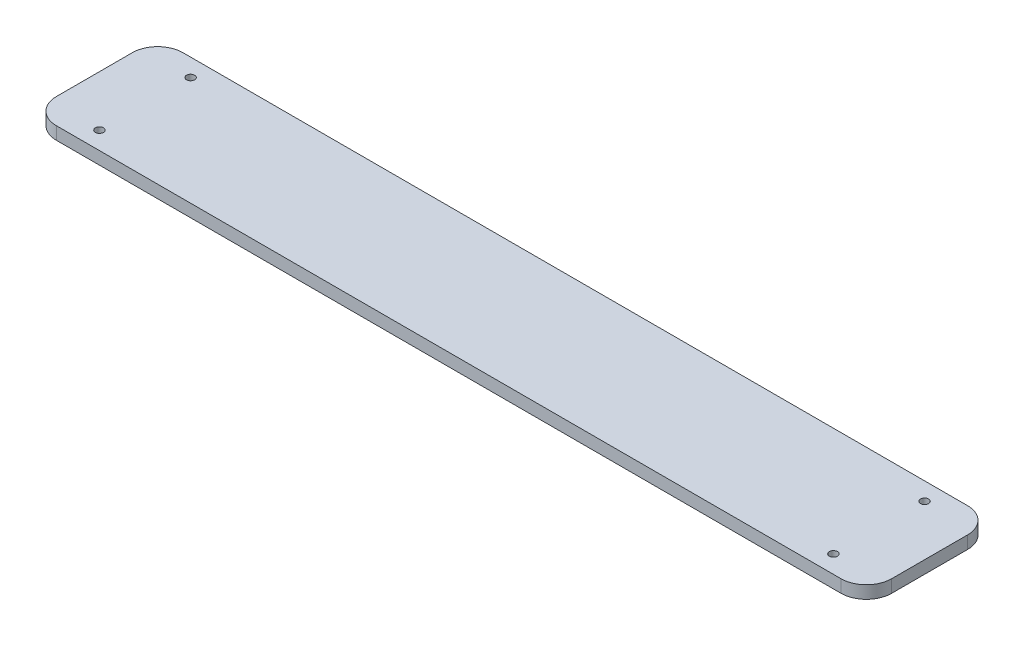
ISO-10303-21;
HEADER;
FILE_DESCRIPTION(('STEP AP214'),'2;1');
FILE_NAME('part.step','',(''),(''),'','','');
FILE_SCHEMA(('AUTOMOTIVE_DESIGN { 1 0 10303 214 1 1 1 1 }'));
ENDSEC;
DATA;
#1=APPLICATION_CONTEXT('core data for automotive mechanical design processes');
#2=APPLICATION_PROTOCOL_DEFINITION('international standard','automotive_design',2000,#1);
#3=PRODUCT_CONTEXT('',#1,'mechanical');
#4=PRODUCT('Part','Part','',(#3));
#5=PRODUCT_RELATED_PRODUCT_CATEGORY('part','',(#4));
#6=PRODUCT_DEFINITION_FORMATION('','',#4);
#7=PRODUCT_DEFINITION_CONTEXT('part definition',#1,'design');
#8=PRODUCT_DEFINITION('design','',#6,#7);
#9=PRODUCT_DEFINITION_SHAPE('','',#8);
#10=(LENGTH_UNIT() NAMED_UNIT(*) SI_UNIT(.MILLI.,.METRE.));
#11=(NAMED_UNIT(*) PLANE_ANGLE_UNIT() SI_UNIT($,.RADIAN.));
#12=(NAMED_UNIT(*) SI_UNIT($,.STERADIAN.) SOLID_ANGLE_UNIT());
#13=UNCERTAINTY_MEASURE_WITH_UNIT(LENGTH_MEASURE(1.E-05),#10,'distance_accuracy_value','');
#14=(GEOMETRIC_REPRESENTATION_CONTEXT(3) GLOBAL_UNCERTAINTY_ASSIGNED_CONTEXT((#13)) GLOBAL_UNIT_ASSIGNED_CONTEXT((#10,
#11,#12)) REPRESENTATION_CONTEXT('',''));
#15=CARTESIAN_POINT('',(0.,0.,0.));
#16=DIRECTION('',(0.,0.,1.));
#17=DIRECTION('',(1.,0.,0.));
#18=AXIS2_PLACEMENT_3D('',#15,#16,#17);
#19=CARTESIAN_POINT('',(0.,5.,0.));
#20=DIRECTION('',(0.,-1.,0.));
#21=DIRECTION('',(0.,0.,-1.));
#22=AXIS2_PLACEMENT_3D('',#19,#20,#21);
#23=PLANE('',#22);
#24=DIRECTION('',(1.,0.,0.));
#25=VECTOR('',#24,1.);
#26=CARTESIAN_POINT('',(0.,5.,0.));
#27=LINE('',#26,#25);
#28=CARTESIAN_POINT('',(10.,5.,0.));
#29=VERTEX_POINT('',#28);
#30=CARTESIAN_POINT('',(320.,5.,0.));
#31=VERTEX_POINT('',#30);
#32=EDGE_CURVE('E204',#29,#31,#27,.T.);
#33=ORIENTED_EDGE('',*,*,#32,.T.);
#34=CARTESIAN_POINT('',(320.,5.,-10.));
#35=DIRECTION('',(0.,-1.,0.));
#36=DIRECTION('',(0.,0.,-1.));
#37=AXIS2_PLACEMENT_3D('',#34,#35,#36);
#38=CIRCLE('',#37,10.);
#39=CARTESIAN_POINT('',(330.,5.,-10.));
#40=VERTEX_POINT('',#39);
#41=EDGE_CURVE('E173',#31,#40,#38,.F.);
#42=ORIENTED_EDGE('',*,*,#41,.T.);
#43=DIRECTION('',(0.,0.,-1.));
#44=VECTOR('',#43,1.);
#45=CARTESIAN_POINT('',(330.,5.,0.));
#46=LINE('',#45,#44);
#47=CARTESIAN_POINT('',(330.,5.,-40.));
#48=VERTEX_POINT('',#47);
#49=EDGE_CURVE('E130',#40,#48,#46,.T.);
#50=ORIENTED_EDGE('',*,*,#49,.T.);
#51=CARTESIAN_POINT('',(320.,5.,-40.));
#52=DIRECTION('',(0.,-1.,0.));
#53=DIRECTION('',(0.,0.,-1.));
#54=AXIS2_PLACEMENT_3D('',#51,#52,#53);
#55=CIRCLE('',#54,10.);
#56=CARTESIAN_POINT('',(320.,5.,-50.));
#57=VERTEX_POINT('',#56);
#58=EDGE_CURVE('E66',#48,#57,#55,.F.);
#59=ORIENTED_EDGE('',*,*,#58,.T.);
#60=DIRECTION('',(-1.,0.,0.));
#61=VECTOR('',#60,1.);
#62=CARTESIAN_POINT('',(0.,5.,-50.));
#63=LINE('',#62,#61);
#64=CARTESIAN_POINT('',(10.,5.,-50.));
#65=VERTEX_POINT('',#64);
#66=EDGE_CURVE('E151',#57,#65,#63,.T.);
#67=ORIENTED_EDGE('',*,*,#66,.T.);
#68=CARTESIAN_POINT('',(10.,5.,-40.));
#69=DIRECTION('',(0.,-1.,0.));
#70=DIRECTION('',(0.,0.,-1.));
#71=AXIS2_PLACEMENT_3D('',#68,#69,#70);
#72=CIRCLE('',#71,10.);
#73=CARTESIAN_POINT('',(0.,5.,-40.));
#74=VERTEX_POINT('',#73);
#75=EDGE_CURVE('E165',#65,#74,#72,.F.);
#76=ORIENTED_EDGE('',*,*,#75,.T.);
#77=DIRECTION('',(0.,0.,1.));
#78=VECTOR('',#77,1.);
#79=CARTESIAN_POINT('',(0.,5.,0.));
#80=LINE('',#79,#78);
#81=CARTESIAN_POINT('',(0.,5.,-10.));
#82=VERTEX_POINT('',#81);
#83=EDGE_CURVE('E144',#74,#82,#80,.T.);
#84=ORIENTED_EDGE('',*,*,#83,.T.);
#85=CARTESIAN_POINT('',(10.,5.,-10.));
#86=DIRECTION('',(0.,-1.,0.));
#87=DIRECTION('',(0.,0.,-1.));
#88=AXIS2_PLACEMENT_3D('',#85,#86,#87);
#89=CIRCLE('',#88,10.);
#90=EDGE_CURVE('E168',#82,#29,#89,.F.);
#91=ORIENTED_EDGE('',*,*,#90,.T.);
#92=EDGE_LOOP('',(#33,#42,#50,#59,#67,#76,#84,#91));
#93=FACE_BOUND('',#92,.T.);
#94=CARTESIAN_POINT('',(20.,5.,-43.));
#95=DIRECTION('',(0.,1.,0.));
#96=DIRECTION('',(0.,0.,1.));
#97=AXIS2_PLACEMENT_3D('',#94,#95,#96);
#98=CIRCLE('',#97,1.6);
#99=CARTESIAN_POINT('',(20.,5.,-41.4));
#100=VERTEX_POINT('',#99);
#101=EDGE_CURVE('E194',#100,#100,#98,.T.);
#102=ORIENTED_EDGE('',*,*,#101,.F.);
#103=EDGE_LOOP('',(#102));
#104=FACE_BOUND('',#103,.T.);
#105=CARTESIAN_POINT('',(20.,5.,-7.));
#106=DIRECTION('',(0.,1.,0.));
#107=DIRECTION('',(0.,0.,1.));
#108=AXIS2_PLACEMENT_3D('',#105,#106,#107);
#109=CIRCLE('',#108,1.6);
#110=CARTESIAN_POINT('',(20.,5.,-5.4));
#111=VERTEX_POINT('',#110);
#112=EDGE_CURVE('E212',#111,#111,#109,.T.);
#113=ORIENTED_EDGE('',*,*,#112,.F.);
#114=EDGE_LOOP('',(#113));
#115=FACE_BOUND('',#114,.T.);
#116=CARTESIAN_POINT('',(310.,5.,-7.));
#117=DIRECTION('',(0.,1.,0.));
#118=DIRECTION('',(0.,0.,-1.));
#119=AXIS2_PLACEMENT_3D('',#116,#117,#118);
#120=CIRCLE('',#119,1.60000000000007);
#121=CARTESIAN_POINT('',(310.,5.,-8.60000000000007));
#122=VERTEX_POINT('',#121);
#123=EDGE_CURVE('E218',#122,#122,#120,.T.);
#124=ORIENTED_EDGE('',*,*,#123,.F.);
#125=EDGE_LOOP('',(#124));
#126=FACE_BOUND('',#125,.T.);
#127=CARTESIAN_POINT('',(310.,5.,-43.));
#128=DIRECTION('',(0.,1.,0.));
#129=DIRECTION('',(0.,0.,-1.));
#130=AXIS2_PLACEMENT_3D('',#127,#128,#129);
#131=CIRCLE('',#130,1.60000000000007);
#132=CARTESIAN_POINT('',(310.,5.,-44.6000000000001));
#133=VERTEX_POINT('',#132);
#134=EDGE_CURVE('E226',#133,#133,#131,.T.);
#135=ORIENTED_EDGE('',*,*,#134,.F.);
#136=EDGE_LOOP('',(#135));
#137=FACE_BOUND('',#136,.T.);
#138=ADVANCED_FACE('F43',(#93,#104,#115,#126,#137),#23,.F.);
#139=CARTESIAN_POINT('',(0.,0.,0.));
#140=DIRECTION('',(0.,-1.,0.));
#141=DIRECTION('',(0.,0.,-1.));
#142=AXIS2_PLACEMENT_3D('',#139,#140,#141);
#143=PLANE('',#142);
#144=CARTESIAN_POINT('',(310.,0.,-7.));
#145=DIRECTION('',(0.,1.,0.));
#146=DIRECTION('',(0.,0.,-1.));
#147=AXIS2_PLACEMENT_3D('',#144,#145,#146);
#148=CIRCLE('',#147,1.60000000000007);
#149=CARTESIAN_POINT('',(310.,0.,-8.60000000000007));
#150=VERTEX_POINT('',#149);
#151=EDGE_CURVE('E222',#150,#150,#148,.T.);
#152=ORIENTED_EDGE('',*,*,#151,.T.);
#153=EDGE_LOOP('',(#152));
#154=FACE_BOUND('',#153,.T.);
#155=CARTESIAN_POINT('',(20.,0.,-43.));
#156=DIRECTION('',(0.,1.,0.));
#157=DIRECTION('',(0.,0.,1.));
#158=AXIS2_PLACEMENT_3D('',#155,#156,#157);
#159=CIRCLE('',#158,1.6);
#160=CARTESIAN_POINT('',(20.,0.,-41.4));
#161=VERTEX_POINT('',#160);
#162=EDGE_CURVE('E197',#161,#161,#159,.T.);
#163=ORIENTED_EDGE('',*,*,#162,.T.);
#164=EDGE_LOOP('',(#163));
#165=FACE_BOUND('',#164,.T.);
#166=DIRECTION('',(0.,0.,-1.));
#167=VECTOR('',#166,1.);
#168=CARTESIAN_POINT('',(330.,0.,0.));
#169=LINE('',#168,#167);
#170=CARTESIAN_POINT('',(330.,0.,-10.));
#171=VERTEX_POINT('',#170);
#172=CARTESIAN_POINT('',(330.,0.,-40.));
#173=VERTEX_POINT('',#172);
#174=EDGE_CURVE('E128',#171,#173,#169,.T.);
#175=ORIENTED_EDGE('',*,*,#174,.F.);
#176=CARTESIAN_POINT('',(320.,0.,-10.));
#177=DIRECTION('',(0.,-1.,0.));
#178=DIRECTION('',(0.,0.,-1.));
#179=AXIS2_PLACEMENT_3D('',#176,#177,#178);
#180=CIRCLE('',#179,10.);
#181=CARTESIAN_POINT('',(320.,0.,0.));
#182=VERTEX_POINT('',#181);
#183=EDGE_CURVE('E110',#171,#182,#180,.T.);
#184=ORIENTED_EDGE('',*,*,#183,.T.);
#185=DIRECTION('',(1.,0.,0.));
#186=VECTOR('',#185,1.);
#187=CARTESIAN_POINT('',(0.,0.,0.));
#188=LINE('',#187,#186);
#189=CARTESIAN_POINT('',(10.,0.,0.));
#190=VERTEX_POINT('',#189);
#191=EDGE_CURVE('E140',#190,#182,#188,.T.);
#192=ORIENTED_EDGE('',*,*,#191,.F.);
#193=CARTESIAN_POINT('',(10.,0.,-10.));
#194=DIRECTION('',(0.,-1.,0.));
#195=DIRECTION('',(0.,0.,-1.));
#196=AXIS2_PLACEMENT_3D('',#193,#194,#195);
#197=CIRCLE('',#196,10.);
#198=CARTESIAN_POINT('',(0.,0.,-10.));
#199=VERTEX_POINT('',#198);
#200=EDGE_CURVE('E155',#190,#199,#197,.T.);
#201=ORIENTED_EDGE('',*,*,#200,.T.);
#202=DIRECTION('',(0.,0.,1.));
#203=VECTOR('',#202,1.);
#204=CARTESIAN_POINT('',(0.,0.,0.));
#205=LINE('',#204,#203);
#206=CARTESIAN_POINT('',(0.,0.,-40.));
#207=VERTEX_POINT('',#206);
#208=EDGE_CURVE('E146',#207,#199,#205,.T.);
#209=ORIENTED_EDGE('',*,*,#208,.F.);
#210=CARTESIAN_POINT('',(10.,0.,-40.));
#211=DIRECTION('',(0.,-1.,0.));
#212=DIRECTION('',(0.,0.,-1.));
#213=AXIS2_PLACEMENT_3D('',#210,#211,#212);
#214=CIRCLE('',#213,10.);
#215=CARTESIAN_POINT('',(10.,0.,-50.));
#216=VERTEX_POINT('',#215);
#217=EDGE_CURVE('E132',#207,#216,#214,.T.);
#218=ORIENTED_EDGE('',*,*,#217,.T.);
#219=DIRECTION('',(-1.,0.,0.));
#220=VECTOR('',#219,1.);
#221=CARTESIAN_POINT('',(0.,0.,-50.));
#222=LINE('',#221,#220);
#223=CARTESIAN_POINT('',(320.,0.,-50.));
#224=VERTEX_POINT('',#223);
#225=EDGE_CURVE('E139',#224,#216,#222,.T.);
#226=ORIENTED_EDGE('',*,*,#225,.F.);
#227=CARTESIAN_POINT('',(320.,0.,-40.));
#228=DIRECTION('',(0.,-1.,0.));
#229=DIRECTION('',(0.,0.,-1.));
#230=AXIS2_PLACEMENT_3D('',#227,#228,#229);
#231=CIRCLE('',#230,10.);
#232=EDGE_CURVE('E122',#224,#173,#231,.T.);
#233=ORIENTED_EDGE('',*,*,#232,.T.);
#234=EDGE_LOOP('',(#175,#184,#192,#201,#209,#218,#226,#233));
#235=FACE_BOUND('',#234,.T.);
#236=CARTESIAN_POINT('',(20.,0.,-7.));
#237=DIRECTION('',(0.,1.,0.));
#238=DIRECTION('',(0.,0.,1.));
#239=AXIS2_PLACEMENT_3D('',#236,#237,#238);
#240=CIRCLE('',#239,1.6);
#241=CARTESIAN_POINT('',(20.,0.,-5.4));
#242=VERTEX_POINT('',#241);
#243=EDGE_CURVE('E214',#242,#242,#240,.T.);
#244=ORIENTED_EDGE('',*,*,#243,.T.);
#245=EDGE_LOOP('',(#244));
#246=FACE_BOUND('',#245,.T.);
#247=CARTESIAN_POINT('',(310.,0.,-43.));
#248=DIRECTION('',(0.,1.,0.));
#249=DIRECTION('',(0.,0.,-1.));
#250=AXIS2_PLACEMENT_3D('',#247,#248,#249);
#251=CIRCLE('',#250,1.60000000000007);
#252=CARTESIAN_POINT('',(310.,0.,-44.6000000000001));
#253=VERTEX_POINT('',#252);
#254=EDGE_CURVE('E230',#253,#253,#251,.T.);
#255=ORIENTED_EDGE('',*,*,#254,.T.);
#256=EDGE_LOOP('',(#255));
#257=FACE_BOUND('',#256,.T.);
#258=ADVANCED_FACE('F135',(#154,#165,#235,#246,#257),#143,.T.);
#259=CARTESIAN_POINT('',(0.,5.,0.));
#260=DIRECTION('',(1.,0.,0.));
#261=DIRECTION('',(0.,0.,-1.));
#262=AXIS2_PLACEMENT_3D('',#259,#260,#261);
#263=PLANE('',#262);
#264=ORIENTED_EDGE('',*,*,#208,.T.);
#265=DIRECTION('',(0.,-1.,0.));
#266=VECTOR('',#265,1.);
#267=CARTESIAN_POINT('',(0.,5.,-10.));
#268=LINE('',#267,#266);
#269=EDGE_CURVE('E11',#199,#82,#268,.F.);
#270=ORIENTED_EDGE('',*,*,#269,.T.);
#271=ORIENTED_EDGE('',*,*,#83,.F.);
#272=DIRECTION('',(0.,-1.,0.));
#273=VECTOR('',#272,1.);
#274=CARTESIAN_POINT('',(0.,5.,-40.));
#275=LINE('',#274,#273);
#276=EDGE_CURVE('E52',#74,#207,#275,.T.);
#277=ORIENTED_EDGE('',*,*,#276,.T.);
#278=EDGE_LOOP('',(#264,#270,#271,#277));
#279=FACE_BOUND('',#278,.T.);
#280=ADVANCED_FACE('F188',(#279),#263,.F.);
#281=CARTESIAN_POINT('',(0.,5.,0.));
#282=DIRECTION('',(0.,0.,-1.));
#283=DIRECTION('',(-1.,0.,0.));
#284=AXIS2_PLACEMENT_3D('',#281,#282,#283);
#285=PLANE('',#284);
#286=ORIENTED_EDGE('',*,*,#191,.T.);
#287=DIRECTION('',(0.,-1.,0.));
#288=VECTOR('',#287,1.);
#289=CARTESIAN_POINT('',(320.,5.,0.));
#290=LINE('',#289,#288);
#291=EDGE_CURVE('E115',#182,#31,#290,.F.);
#292=ORIENTED_EDGE('',*,*,#291,.T.);
#293=ORIENTED_EDGE('',*,*,#32,.F.);
#294=DIRECTION('',(0.,-1.,0.));
#295=VECTOR('',#294,1.);
#296=CARTESIAN_POINT('',(10.,5.,0.));
#297=LINE('',#296,#295);
#298=EDGE_CURVE('E121',#29,#190,#297,.T.);
#299=ORIENTED_EDGE('',*,*,#298,.T.);
#300=EDGE_LOOP('',(#286,#292,#293,#299));
#301=FACE_BOUND('',#300,.T.);
#302=ADVANCED_FACE('F258',(#301),#285,.F.);
#303=CARTESIAN_POINT('',(330.,5.,0.));
#304=DIRECTION('',(-1.,0.,0.));
#305=DIRECTION('',(0.,0.,1.));
#306=AXIS2_PLACEMENT_3D('',#303,#304,#305);
#307=PLANE('',#306);
#308=ORIENTED_EDGE('',*,*,#49,.F.);
#309=DIRECTION('',(0.,-1.,0.));
#310=VECTOR('',#309,1.);
#311=CARTESIAN_POINT('',(330.,5.,-10.));
#312=LINE('',#311,#310);
#313=EDGE_CURVE('E114',#40,#171,#312,.T.);
#314=ORIENTED_EDGE('',*,*,#313,.T.);
#315=ORIENTED_EDGE('',*,*,#174,.T.);
#316=DIRECTION('',(0.,-1.,0.));
#317=VECTOR('',#316,1.);
#318=CARTESIAN_POINT('',(330.,5.,-40.));
#319=LINE('',#318,#317);
#320=EDGE_CURVE('E133',#173,#48,#319,.F.);
#321=ORIENTED_EDGE('',*,*,#320,.T.);
#322=EDGE_LOOP('',(#308,#314,#315,#321));
#323=FACE_BOUND('',#322,.T.);
#324=ADVANCED_FACE('F127',(#323),#307,.F.);
#325=CARTESIAN_POINT('',(0.,5.,-50.));
#326=DIRECTION('',(0.,0.,1.));
#327=DIRECTION('',(1.,0.,0.));
#328=AXIS2_PLACEMENT_3D('',#325,#326,#327);
#329=PLANE('',#328);
#330=ORIENTED_EDGE('',*,*,#66,.F.);
#331=DIRECTION('',(0.,-1.,0.));
#332=VECTOR('',#331,1.);
#333=CARTESIAN_POINT('',(320.,5.,-50.));
#334=LINE('',#333,#332);
#335=EDGE_CURVE('E178',#57,#224,#334,.T.);
#336=ORIENTED_EDGE('',*,*,#335,.T.);
#337=ORIENTED_EDGE('',*,*,#225,.T.);
#338=DIRECTION('',(0.,-1.,0.));
#339=VECTOR('',#338,1.);
#340=CARTESIAN_POINT('',(10.,5.,-50.));
#341=LINE('',#340,#339);
#342=EDGE_CURVE('E59',#216,#65,#341,.F.);
#343=ORIENTED_EDGE('',*,*,#342,.T.);
#344=EDGE_LOOP('',(#330,#336,#337,#343));
#345=FACE_BOUND('',#344,.T.);
#346=ADVANCED_FACE('F253',(#345),#329,.F.);
#347=CARTESIAN_POINT('',(20.,5.,-43.));
#348=DIRECTION('',(0.,-1.,0.));
#349=DIRECTION('',(0.,0.,-1.));
#350=AXIS2_PLACEMENT_3D('',#347,#348,#349);
#351=CYLINDRICAL_SURFACE('',#350,1.6);
#352=ORIENTED_EDGE('',*,*,#101,.T.);
#353=EDGE_LOOP('',(#352));
#354=FACE_BOUND('',#353,.T.);
#355=ORIENTED_EDGE('',*,*,#162,.F.);
#356=EDGE_LOOP('',(#355));
#357=FACE_BOUND('',#356,.T.);
#358=ADVANCED_FACE('F250',(#354,#357),#351,.F.);
#359=CARTESIAN_POINT('',(20.,5.,-7.));
#360=DIRECTION('',(0.,-1.,0.));
#361=DIRECTION('',(0.,0.,-1.));
#362=AXIS2_PLACEMENT_3D('',#359,#360,#361);
#363=CYLINDRICAL_SURFACE('',#362,1.6);
#364=ORIENTED_EDGE('',*,*,#112,.T.);
#365=EDGE_LOOP('',(#364));
#366=FACE_BOUND('',#365,.T.);
#367=ORIENTED_EDGE('',*,*,#243,.F.);
#368=EDGE_LOOP('',(#367));
#369=FACE_BOUND('',#368,.T.);
#370=ADVANCED_FACE('F362',(#366,#369),#363,.F.);
#371=CARTESIAN_POINT('',(310.,5.,-7.));
#372=DIRECTION('',(0.,-1.,0.));
#373=DIRECTION('',(0.,0.,-1.));
#374=AXIS2_PLACEMENT_3D('',#371,#372,#373);
#375=CYLINDRICAL_SURFACE('',#374,1.60000000000007);
#376=ORIENTED_EDGE('',*,*,#123,.T.);
#377=EDGE_LOOP('',(#376));
#378=FACE_BOUND('',#377,.T.);
#379=ORIENTED_EDGE('',*,*,#151,.F.);
#380=EDGE_LOOP('',(#379));
#381=FACE_BOUND('',#380,.T.);
#382=ADVANCED_FACE('F352',(#378,#381),#375,.F.);
#383=CARTESIAN_POINT('',(310.,5.,-43.));
#384=DIRECTION('',(0.,-1.,0.));
#385=DIRECTION('',(0.,0.,-1.));
#386=AXIS2_PLACEMENT_3D('',#383,#384,#385);
#387=CYLINDRICAL_SURFACE('',#386,1.60000000000007);
#388=ORIENTED_EDGE('',*,*,#134,.T.);
#389=EDGE_LOOP('',(#388));
#390=FACE_BOUND('',#389,.T.);
#391=ORIENTED_EDGE('',*,*,#254,.F.);
#392=EDGE_LOOP('',(#391));
#393=FACE_BOUND('',#392,.T.);
#394=ADVANCED_FACE('F238',(#390,#393),#387,.F.);
#395=CARTESIAN_POINT('',(320.,5.,-10.));
#396=DIRECTION('',(0.,-1.,0.));
#397=DIRECTION('',(0.,0.,-1.));
#398=AXIS2_PLACEMENT_3D('',#395,#396,#397);
#399=CYLINDRICAL_SURFACE('',#398,10.);
#400=ORIENTED_EDGE('',*,*,#41,.F.);
#401=ORIENTED_EDGE('',*,*,#291,.F.);
#402=ORIENTED_EDGE('',*,*,#183,.F.);
#403=ORIENTED_EDGE('',*,*,#313,.F.);
#404=EDGE_LOOP('',(#400,#401,#402,#403));
#405=FACE_BOUND('',#404,.T.);
#406=ADVANCED_FACE('F113',(#405),#399,.T.);
#407=CARTESIAN_POINT('',(320.,5.,-40.));
#408=DIRECTION('',(0.,-1.,0.));
#409=DIRECTION('',(0.,0.,-1.));
#410=AXIS2_PLACEMENT_3D('',#407,#408,#409);
#411=CYLINDRICAL_SURFACE('',#410,10.);
#412=ORIENTED_EDGE('',*,*,#58,.F.);
#413=ORIENTED_EDGE('',*,*,#320,.F.);
#414=ORIENTED_EDGE('',*,*,#232,.F.);
#415=ORIENTED_EDGE('',*,*,#335,.F.);
#416=EDGE_LOOP('',(#412,#413,#414,#415));
#417=FACE_BOUND('',#416,.T.);
#418=ADVANCED_FACE('F266',(#417),#411,.T.);
#419=CARTESIAN_POINT('',(10.,5.,-10.));
#420=DIRECTION('',(0.,-1.,0.));
#421=DIRECTION('',(0.,0.,-1.));
#422=AXIS2_PLACEMENT_3D('',#419,#420,#421);
#423=CYLINDRICAL_SURFACE('',#422,10.);
#424=ORIENTED_EDGE('',*,*,#90,.F.);
#425=ORIENTED_EDGE('',*,*,#269,.F.);
#426=ORIENTED_EDGE('',*,*,#200,.F.);
#427=ORIENTED_EDGE('',*,*,#298,.F.);
#428=EDGE_LOOP('',(#424,#425,#426,#427));
#429=FACE_BOUND('',#428,.T.);
#430=ADVANCED_FACE('F268',(#429),#423,.T.);
#431=CARTESIAN_POINT('',(10.,5.,-40.));
#432=DIRECTION('',(0.,-1.,0.));
#433=DIRECTION('',(0.,0.,-1.));
#434=AXIS2_PLACEMENT_3D('',#431,#432,#433);
#435=CYLINDRICAL_SURFACE('',#434,10.);
#436=ORIENTED_EDGE('',*,*,#75,.F.);
#437=ORIENTED_EDGE('',*,*,#342,.F.);
#438=ORIENTED_EDGE('',*,*,#217,.F.);
#439=ORIENTED_EDGE('',*,*,#276,.F.);
#440=EDGE_LOOP('',(#436,#437,#438,#439));
#441=FACE_BOUND('',#440,.T.);
#442=ADVANCED_FACE('F45',(#441),#435,.T.);
#443=CLOSED_SHELL('',(#138,#258,#280,#302,#324,#346,#358,#370,#382,#394,#406,#418,#430,#442));
#444=MANIFOLD_SOLID_BREP('B2',#443);
#445=ADVANCED_BREP_SHAPE_REPRESENTATION('',(#18,#444),#14);
#446=SHAPE_DEFINITION_REPRESENTATION(#9,#445);
ENDSEC;
END-ISO-10303-21;
